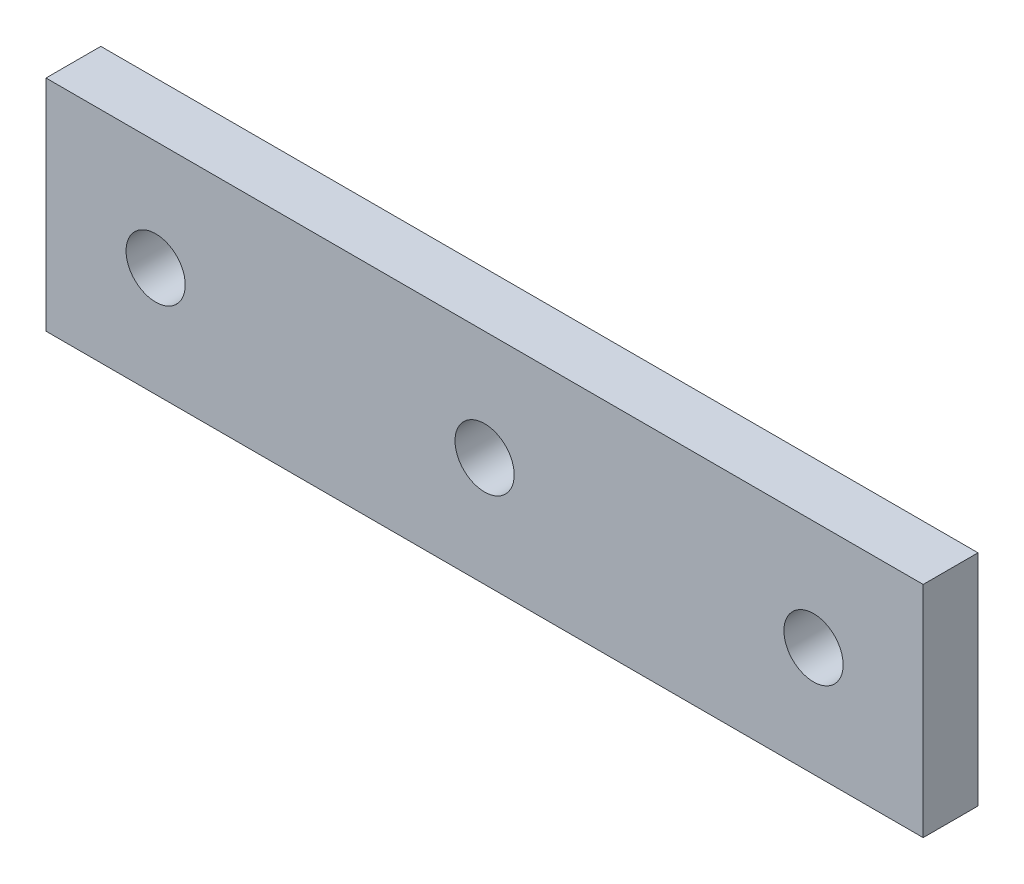
ISO-10303-21;
HEADER;
FILE_DESCRIPTION(('STEP AP214'),'2;1');
FILE_NAME('part.step','',(''),(''),'','','');
FILE_SCHEMA(('AUTOMOTIVE_DESIGN { 1 0 10303 214 1 1 1 1 }'));
ENDSEC;
DATA;
#1=APPLICATION_CONTEXT('core data for automotive mechanical design processes');
#2=APPLICATION_PROTOCOL_DEFINITION('international standard','automotive_design',2000,#1);
#3=PRODUCT_CONTEXT('',#1,'mechanical');
#4=PRODUCT('Part','Part','',(#3));
#5=PRODUCT_RELATED_PRODUCT_CATEGORY('part','',(#4));
#6=PRODUCT_DEFINITION_FORMATION('','',#4);
#7=PRODUCT_DEFINITION_CONTEXT('part definition',#1,'design');
#8=PRODUCT_DEFINITION('design','',#6,#7);
#9=PRODUCT_DEFINITION_SHAPE('','',#8);
#10=(LENGTH_UNIT() NAMED_UNIT(*) SI_UNIT(.MILLI.,.METRE.));
#11=(NAMED_UNIT(*) PLANE_ANGLE_UNIT() SI_UNIT($,.RADIAN.));
#12=(NAMED_UNIT(*) SI_UNIT($,.STERADIAN.) SOLID_ANGLE_UNIT());
#13=UNCERTAINTY_MEASURE_WITH_UNIT(LENGTH_MEASURE(1.E-05),#10,'distance_accuracy_value','');
#14=(GEOMETRIC_REPRESENTATION_CONTEXT(3) GLOBAL_UNCERTAINTY_ASSIGNED_CONTEXT((#13)) GLOBAL_UNIT_ASSIGNED_CONTEXT((#10,
#11,#12)) REPRESENTATION_CONTEXT('',''));
#15=CARTESIAN_POINT('',(0.,0.,0.));
#16=DIRECTION('',(0.,0.,1.));
#17=DIRECTION('',(1.,0.,0.));
#18=AXIS2_PLACEMENT_3D('',#15,#16,#17);
#19=CARTESIAN_POINT('',(0.,0.,6.35));
#20=DIRECTION('',(0.,0.,-1.));
#21=DIRECTION('',(-1.,0.,0.));
#22=AXIS2_PLACEMENT_3D('',#19,#20,#21);
#23=PLANE('',#22);
#24=DIRECTION('',(0.,1.,0.));
#25=VECTOR('',#24,1.);
#26=CARTESIAN_POINT('',(50.8,-12.7,6.35));
#27=LINE('',#26,#25);
#28=CARTESIAN_POINT('',(50.8,-12.7,6.35));
#29=VERTEX_POINT('',#28);
#30=CARTESIAN_POINT('',(50.8,12.7,6.35));
#31=VERTEX_POINT('',#30);
#32=EDGE_CURVE('E86',#29,#31,#27,.T.);
#33=ORIENTED_EDGE('',*,*,#32,.T.);
#34=DIRECTION('',(-1.,0.,0.));
#35=VECTOR('',#34,1.);
#36=CARTESIAN_POINT('',(-50.8,12.7,6.35));
#37=LINE('',#36,#35);
#38=CARTESIAN_POINT('',(-50.8,12.7,6.35));
#39=VERTEX_POINT('',#38);
#40=EDGE_CURVE('E81',#31,#39,#37,.T.);
#41=ORIENTED_EDGE('',*,*,#40,.T.);
#42=DIRECTION('',(0.,-1.,0.));
#43=VECTOR('',#42,1.);
#44=CARTESIAN_POINT('',(-50.8,-12.7,6.35));
#45=LINE('',#44,#43);
#46=CARTESIAN_POINT('',(-50.8,-12.7,6.35));
#47=VERTEX_POINT('',#46);
#48=EDGE_CURVE('E84',#39,#47,#45,.T.);
#49=ORIENTED_EDGE('',*,*,#48,.T.);
#50=DIRECTION('',(1.,0.,0.));
#51=VECTOR('',#50,1.);
#52=CARTESIAN_POINT('',(-50.8,-12.7,6.35));
#53=LINE('',#52,#51);
#54=EDGE_CURVE('E51',#47,#29,#53,.T.);
#55=ORIENTED_EDGE('',*,*,#54,.T.);
#56=EDGE_LOOP('',(#33,#41,#49,#55));
#57=FACE_BOUND('',#56,.T.);
#58=CARTESIAN_POINT('',(0.,0.,6.35));
#59=DIRECTION('',(0.,0.,1.));
#60=DIRECTION('',(1.,0.,0.));
#61=AXIS2_PLACEMENT_3D('',#58,#59,#60);
#62=CIRCLE('',#61,3.429);
#63=CARTESIAN_POINT('',(3.42899999999999,0.,6.35));
#64=VERTEX_POINT('',#63);
#65=EDGE_CURVE('E101',#64,#64,#62,.T.);
#66=ORIENTED_EDGE('',*,*,#65,.F.);
#67=EDGE_LOOP('',(#66));
#68=FACE_BOUND('',#67,.T.);
#69=CARTESIAN_POINT('',(-38.1,0.,6.35));
#70=DIRECTION('',(0.,0.,1.));
#71=DIRECTION('',(1.,0.,0.));
#72=AXIS2_PLACEMENT_3D('',#69,#70,#71);
#73=CIRCLE('',#72,3.429);
#74=CARTESIAN_POINT('',(-34.671,0.,6.35));
#75=VERTEX_POINT('',#74);
#76=EDGE_CURVE('E116',#75,#75,#73,.T.);
#77=ORIENTED_EDGE('',*,*,#76,.F.);
#78=EDGE_LOOP('',(#77));
#79=FACE_BOUND('',#78,.T.);
#80=CARTESIAN_POINT('',(38.1,0.,6.35));
#81=DIRECTION('',(0.,0.,1.));
#82=DIRECTION('',(-1.,0.,0.));
#83=AXIS2_PLACEMENT_3D('',#80,#81,#82);
#84=CIRCLE('',#83,3.429);
#85=CARTESIAN_POINT('',(34.671,0.,6.35));
#86=VERTEX_POINT('',#85);
#87=EDGE_CURVE('E122',#86,#86,#84,.T.);
#88=ORIENTED_EDGE('',*,*,#87,.F.);
#89=EDGE_LOOP('',(#88));
#90=FACE_BOUND('',#89,.T.);
#91=ADVANCED_FACE('F34',(#57,#68,#79,#90),#23,.F.);
#92=CARTESIAN_POINT('',(0.,0.,0.));
#93=DIRECTION('',(0.,0.,-1.));
#94=DIRECTION('',(-1.,0.,0.));
#95=AXIS2_PLACEMENT_3D('',#92,#93,#94);
#96=PLANE('',#95);
#97=CARTESIAN_POINT('',(-38.1,0.,0.));
#98=DIRECTION('',(0.,0.,1.));
#99=DIRECTION('',(1.,0.,0.));
#100=AXIS2_PLACEMENT_3D('',#97,#98,#99);
#101=CIRCLE('',#100,3.429);
#102=CARTESIAN_POINT('',(-34.671,0.,0.));
#103=VERTEX_POINT('',#102);
#104=EDGE_CURVE('E119',#103,#103,#101,.T.);
#105=ORIENTED_EDGE('',*,*,#104,.T.);
#106=EDGE_LOOP('',(#105));
#107=FACE_BOUND('',#106,.T.);
#108=DIRECTION('',(0.,1.,0.));
#109=VECTOR('',#108,1.);
#110=CARTESIAN_POINT('',(50.8,-12.7,0.));
#111=LINE('',#110,#109);
#112=CARTESIAN_POINT('',(50.8,-12.7,0.));
#113=VERTEX_POINT('',#112);
#114=CARTESIAN_POINT('',(50.8,12.7,0.));
#115=VERTEX_POINT('',#114);
#116=EDGE_CURVE('E98',#113,#115,#111,.T.);
#117=ORIENTED_EDGE('',*,*,#116,.F.);
#118=DIRECTION('',(1.,0.,0.));
#119=VECTOR('',#118,1.);
#120=CARTESIAN_POINT('',(-50.8,-12.7,0.));
#121=LINE('',#120,#119);
#122=CARTESIAN_POINT('',(-50.8,-12.7,0.));
#123=VERTEX_POINT('',#122);
#124=EDGE_CURVE('E74',#123,#113,#121,.T.);
#125=ORIENTED_EDGE('',*,*,#124,.F.);
#126=DIRECTION('',(0.,-1.,0.));
#127=VECTOR('',#126,1.);
#128=CARTESIAN_POINT('',(-50.8,-12.7,0.));
#129=LINE('',#128,#127);
#130=CARTESIAN_POINT('',(-50.8,12.7,0.));
#131=VERTEX_POINT('',#130);
#132=EDGE_CURVE('E68',#131,#123,#129,.T.);
#133=ORIENTED_EDGE('',*,*,#132,.F.);
#134=DIRECTION('',(-1.,0.,0.));
#135=VECTOR('',#134,1.);
#136=CARTESIAN_POINT('',(-50.8,12.7,0.));
#137=LINE('',#136,#135);
#138=EDGE_CURVE('E90',#115,#131,#137,.T.);
#139=ORIENTED_EDGE('',*,*,#138,.F.);
#140=EDGE_LOOP('',(#117,#125,#133,#139));
#141=FACE_BOUND('',#140,.T.);
#142=CARTESIAN_POINT('',(0.,0.,0.));
#143=DIRECTION('',(0.,0.,1.));
#144=DIRECTION('',(1.,0.,0.));
#145=AXIS2_PLACEMENT_3D('',#142,#143,#144);
#146=CIRCLE('',#145,3.429);
#147=CARTESIAN_POINT('',(3.42899999999999,0.,0.));
#148=VERTEX_POINT('',#147);
#149=EDGE_CURVE('E113',#148,#148,#146,.T.);
#150=ORIENTED_EDGE('',*,*,#149,.T.);
#151=EDGE_LOOP('',(#150));
#152=FACE_BOUND('',#151,.T.);
#153=CARTESIAN_POINT('',(38.1,0.,0.));
#154=DIRECTION('',(0.,0.,1.));
#155=DIRECTION('',(-1.,0.,0.));
#156=AXIS2_PLACEMENT_3D('',#153,#154,#155);
#157=CIRCLE('',#156,3.429);
#158=CARTESIAN_POINT('',(34.671,0.,0.));
#159=VERTEX_POINT('',#158);
#160=EDGE_CURVE('E125',#159,#159,#157,.T.);
#161=ORIENTED_EDGE('',*,*,#160,.T.);
#162=EDGE_LOOP('',(#161));
#163=FACE_BOUND('',#162,.T.);
#164=ADVANCED_FACE('F109',(#107,#141,#152,#163),#96,.T.);
#165=CARTESIAN_POINT('',(50.8,-12.7,6.35));
#166=DIRECTION('',(-1.,0.,0.));
#167=DIRECTION('',(0.,0.,1.));
#168=AXIS2_PLACEMENT_3D('',#165,#166,#167);
#169=PLANE('',#168);
#170=ORIENTED_EDGE('',*,*,#116,.T.);
#171=DIRECTION('',(0.,0.,-1.));
#172=VECTOR('',#171,1.);
#173=CARTESIAN_POINT('',(50.8,12.7,6.35));
#174=LINE('',#173,#172);
#175=EDGE_CURVE('E11',#31,#115,#174,.T.);
#176=ORIENTED_EDGE('',*,*,#175,.F.);
#177=ORIENTED_EDGE('',*,*,#32,.F.);
#178=DIRECTION('',(0.,0.,-1.));
#179=VECTOR('',#178,1.);
#180=CARTESIAN_POINT('',(50.8,-12.7,6.35));
#181=LINE('',#180,#179);
#182=EDGE_CURVE('E94',#29,#113,#181,.T.);
#183=ORIENTED_EDGE('',*,*,#182,.T.);
#184=EDGE_LOOP('',(#170,#176,#177,#183));
#185=FACE_BOUND('',#184,.T.);
#186=ADVANCED_FACE('F36',(#185),#169,.F.);
#187=CARTESIAN_POINT('',(-50.8,12.7,6.35));
#188=DIRECTION('',(0.,-1.,0.));
#189=DIRECTION('',(0.,0.,-1.));
#190=AXIS2_PLACEMENT_3D('',#187,#188,#189);
#191=PLANE('',#190);
#192=ORIENTED_EDGE('',*,*,#138,.T.);
#193=DIRECTION('',(0.,0.,-1.));
#194=VECTOR('',#193,1.);
#195=CARTESIAN_POINT('',(-50.8,12.7,6.35));
#196=LINE('',#195,#194);
#197=EDGE_CURVE('E43',#39,#131,#196,.T.);
#198=ORIENTED_EDGE('',*,*,#197,.F.);
#199=ORIENTED_EDGE('',*,*,#40,.F.);
#200=ORIENTED_EDGE('',*,*,#175,.T.);
#201=EDGE_LOOP('',(#192,#198,#199,#200));
#202=FACE_BOUND('',#201,.T.);
#203=ADVANCED_FACE('F89',(#202),#191,.F.);
#204=CARTESIAN_POINT('',(-50.8,-12.7,6.35));
#205=DIRECTION('',(1.,0.,0.));
#206=DIRECTION('',(0.,0.,-1.));
#207=AXIS2_PLACEMENT_3D('',#204,#205,#206);
#208=PLANE('',#207);
#209=ORIENTED_EDGE('',*,*,#132,.T.);
#210=DIRECTION('',(0.,0.,-1.));
#211=VECTOR('',#210,1.);
#212=CARTESIAN_POINT('',(-50.8,-12.7,6.35));
#213=LINE('',#212,#211);
#214=EDGE_CURVE('E91',#47,#123,#213,.T.);
#215=ORIENTED_EDGE('',*,*,#214,.F.);
#216=ORIENTED_EDGE('',*,*,#48,.F.);
#217=ORIENTED_EDGE('',*,*,#197,.T.);
#218=EDGE_LOOP('',(#209,#215,#216,#217));
#219=FACE_BOUND('',#218,.T.);
#220=ADVANCED_FACE('F92',(#219),#208,.F.);
#221=CARTESIAN_POINT('',(-50.8,-12.7,6.35));
#222=DIRECTION('',(0.,1.,0.));
#223=DIRECTION('',(0.,0.,1.));
#224=AXIS2_PLACEMENT_3D('',#221,#222,#223);
#225=PLANE('',#224);
#226=ORIENTED_EDGE('',*,*,#124,.T.);
#227=ORIENTED_EDGE('',*,*,#182,.F.);
#228=ORIENTED_EDGE('',*,*,#54,.F.);
#229=ORIENTED_EDGE('',*,*,#214,.T.);
#230=EDGE_LOOP('',(#226,#227,#228,#229));
#231=FACE_BOUND('',#230,.T.);
#232=ADVANCED_FACE('F106',(#231),#225,.F.);
#233=CARTESIAN_POINT('',(0.,0.,6.35));
#234=DIRECTION('',(0.,0.,-1.));
#235=DIRECTION('',(-1.,0.,0.));
#236=AXIS2_PLACEMENT_3D('',#233,#234,#235);
#237=CYLINDRICAL_SURFACE('',#236,3.429);
#238=ORIENTED_EDGE('',*,*,#65,.T.);
#239=EDGE_LOOP('',(#238));
#240=FACE_BOUND('',#239,.T.);
#241=ORIENTED_EDGE('',*,*,#149,.F.);
#242=EDGE_LOOP('',(#241));
#243=FACE_BOUND('',#242,.T.);
#244=ADVANCED_FACE('F142',(#240,#243),#237,.F.);
#245=CARTESIAN_POINT('',(-38.1,0.,6.35));
#246=DIRECTION('',(0.,0.,-1.));
#247=DIRECTION('',(-1.,0.,0.));
#248=AXIS2_PLACEMENT_3D('',#245,#246,#247);
#249=CYLINDRICAL_SURFACE('',#248,3.429);
#250=ORIENTED_EDGE('',*,*,#76,.T.);
#251=EDGE_LOOP('',(#250));
#252=FACE_BOUND('',#251,.T.);
#253=ORIENTED_EDGE('',*,*,#104,.F.);
#254=EDGE_LOOP('',(#253));
#255=FACE_BOUND('',#254,.T.);
#256=ADVANCED_FACE('F188',(#252,#255),#249,.F.);
#257=CARTESIAN_POINT('',(38.1,0.,6.35));
#258=DIRECTION('',(0.,0.,-1.));
#259=DIRECTION('',(-1.,0.,0.));
#260=AXIS2_PLACEMENT_3D('',#257,#258,#259);
#261=CYLINDRICAL_SURFACE('',#260,3.429);
#262=ORIENTED_EDGE('',*,*,#87,.T.);
#263=EDGE_LOOP('',(#262));
#264=FACE_BOUND('',#263,.T.);
#265=ORIENTED_EDGE('',*,*,#160,.F.);
#266=EDGE_LOOP('',(#265));
#267=FACE_BOUND('',#266,.T.);
#268=ADVANCED_FACE('F131',(#264,#267),#261,.F.);
#269=CLOSED_SHELL('',(#91,#164,#186,#203,#220,#232,#244,#256,#268));
#270=MANIFOLD_SOLID_BREP('B2',#269);
#271=ADVANCED_BREP_SHAPE_REPRESENTATION('',(#18,#270),#14);
#272=SHAPE_DEFINITION_REPRESENTATION(#9,#271);
ENDSEC;
END-ISO-10303-21;
